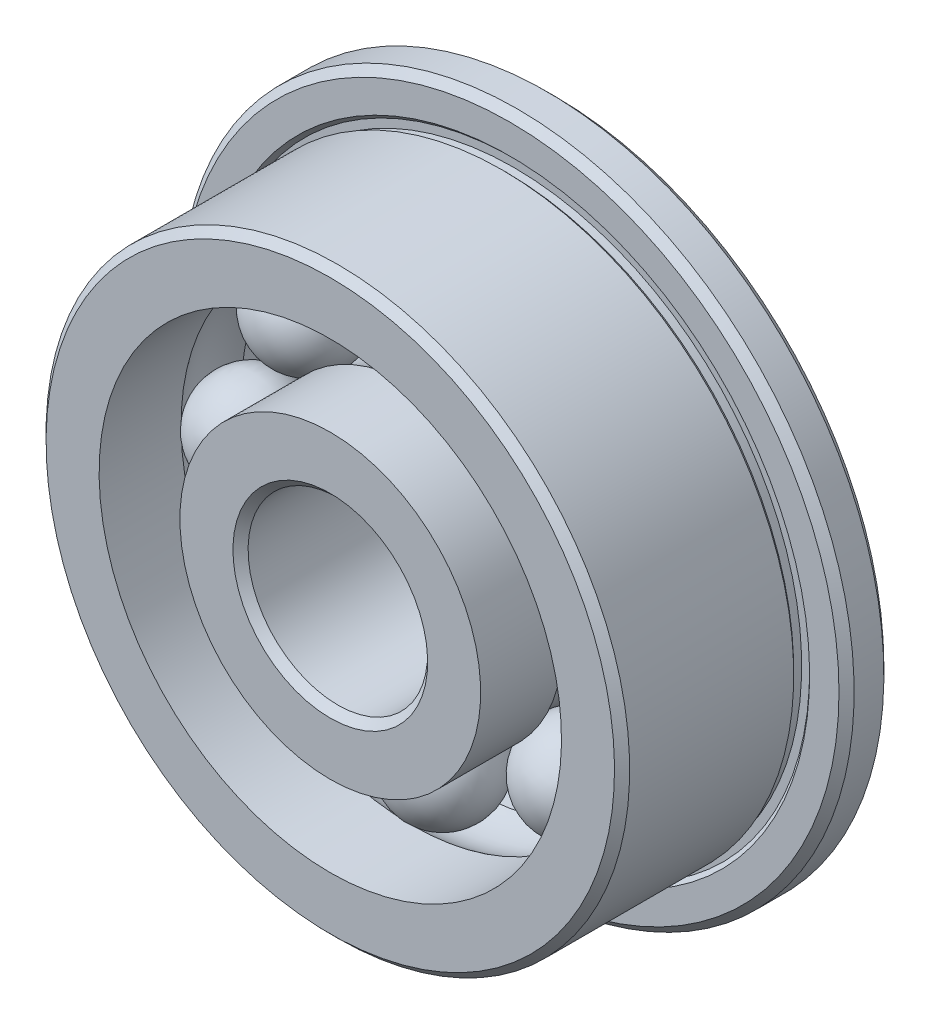
ISO-10303-21;
HEADER;
FILE_DESCRIPTION(('STEP AP214'),'2;1');
FILE_NAME('part.step','',(''),(''),'','','');
FILE_SCHEMA(('AUTOMOTIVE_DESIGN { 1 0 10303 214 1 1 1 1 }'));
ENDSEC;
DATA;
#1=APPLICATION_CONTEXT('core data for automotive mechanical design processes');
#2=APPLICATION_PROTOCOL_DEFINITION('international standard','automotive_design',2000,#1);
#3=PRODUCT_CONTEXT('',#1,'mechanical');
#4=PRODUCT('Part','Part','',(#3));
#5=PRODUCT_RELATED_PRODUCT_CATEGORY('part','',(#4));
#6=PRODUCT_DEFINITION_FORMATION('','',#4);
#7=PRODUCT_DEFINITION_CONTEXT('part definition',#1,'design');
#8=PRODUCT_DEFINITION('design','',#6,#7);
#9=PRODUCT_DEFINITION_SHAPE('','',#8);
#10=(LENGTH_UNIT() NAMED_UNIT(*) SI_UNIT(.MILLI.,.METRE.));
#11=(NAMED_UNIT(*) PLANE_ANGLE_UNIT() SI_UNIT($,.RADIAN.));
#12=(NAMED_UNIT(*) SI_UNIT($,.STERADIAN.) SOLID_ANGLE_UNIT());
#13=UNCERTAINTY_MEASURE_WITH_UNIT(LENGTH_MEASURE(1.E-05),#10,'distance_accuracy_value','');
#14=(GEOMETRIC_REPRESENTATION_CONTEXT(3) GLOBAL_UNCERTAINTY_ASSIGNED_CONTEXT((#13)) GLOBAL_UNIT_ASSIGNED_CONTEXT((#10,
#11,#12)) REPRESENTATION_CONTEXT('',''));
#15=CARTESIAN_POINT('',(0.,0.,0.));
#16=DIRECTION('',(0.,0.,1.));
#17=DIRECTION('',(1.,0.,0.));
#18=AXIS2_PLACEMENT_3D('',#15,#16,#17);
#19=CARTESIAN_POINT('',(-3.00520382004279,3.00520382004286,0.));
#20=DIRECTION('',(-0.707106781186539,0.707106781186556,0.));
#21=DIRECTION('',(0.707106781186556,0.707106781186539,0.));
#22=AXIS2_PLACEMENT_3D('',#19,#20,#21);
#23=SPHERICAL_SURFACE('',#22,1.125);
#24=CARTESIAN_POINT('',(-3.80069894887765,3.80069894887774,0.));
#25=VERTEX_POINT('',#24);
#26=VERTEX_LOOP('',#25);
#27=FACE_BOUND('',#26,.T.);
#28=ADVANCED_FACE('F46',(#27),#23,.T.);
#29=CLOSED_SHELL('',(#28));
#30=MANIFOLD_SOLID_BREP('B2',#29);
#31=CARTESIAN_POINT('',(-4.25,0.,0.));
#32=DIRECTION('',(-1.,0.,0.));
#33=DIRECTION('',(0.,1.,0.));
#34=AXIS2_PLACEMENT_3D('',#31,#32,#33);
#35=SPHERICAL_SURFACE('',#34,1.125);
#36=CARTESIAN_POINT('',(-5.375,0.,0.));
#37=VERTEX_POINT('',#36);
#38=VERTEX_LOOP('',#37);
#39=FACE_BOUND('',#38,.T.);
#40=ADVANCED_FACE('F65',(#39),#35,.T.);
#41=CLOSED_SHELL('',(#40));
#42=MANIFOLD_SOLID_BREP('B7',#41);
#43=CARTESIAN_POINT('',(-3.00520382004285,-3.0052038200428,0.));
#44=DIRECTION('',(-0.707106781186554,-0.707106781186541,0.));
#45=DIRECTION('',(-0.707106781186541,0.707106781186554,0.));
#46=AXIS2_PLACEMENT_3D('',#43,#44,#45);
#47=SPHERICAL_SURFACE('',#46,1.125);
#48=CARTESIAN_POINT('',(-3.80069894887773,-3.80069894887766,0.));
#49=VERTEX_POINT('',#48);
#50=VERTEX_LOOP('',#49);
#51=FACE_BOUND('',#50,.T.);
#52=ADVANCED_FACE('F84',(#51),#47,.T.);
#53=CLOSED_SHELL('',(#52));
#54=MANIFOLD_SOLID_BREP('B42',#53);
#55=CARTESIAN_POINT('',(0.,-4.25,0.));
#56=DIRECTION('',(0.,-1.,0.));
#57=DIRECTION('',(-1.,0.,0.));
#58=AXIS2_PLACEMENT_3D('',#55,#56,#57);
#59=SPHERICAL_SURFACE('',#58,1.125);
#60=CARTESIAN_POINT('',(0.,-5.375,0.));
#61=VERTEX_POINT('',#60);
#62=VERTEX_LOOP('',#61);
#63=FACE_BOUND('',#62,.T.);
#64=ADVANCED_FACE('F103',(#63),#59,.T.);
#65=CLOSED_SHELL('',(#64));
#66=MANIFOLD_SOLID_BREP('B61',#65);
#67=CARTESIAN_POINT('',(3.00520382004281,-3.00520382004284,0.));
#68=DIRECTION('',(0.707106781186544,-0.707106781186551,0.));
#69=DIRECTION('',(-0.707106781186551,-0.707106781186544,0.));
#70=AXIS2_PLACEMENT_3D('',#67,#68,#69);
#71=SPHERICAL_SURFACE('',#70,1.125);
#72=CARTESIAN_POINT('',(3.80069894887767,-3.80069894887771,0.));
#73=VERTEX_POINT('',#72);
#74=VERTEX_LOOP('',#73);
#75=FACE_BOUND('',#74,.T.);
#76=ADVANCED_FACE('F122',(#75),#71,.T.);
#77=CLOSED_SHELL('',(#76));
#78=MANIFOLD_SOLID_BREP('B80',#77);
#79=CARTESIAN_POINT('',(4.25,0.,0.));
#80=DIRECTION('',(1.,0.,0.));
#81=DIRECTION('',(0.,-1.,0.));
#82=AXIS2_PLACEMENT_3D('',#79,#80,#81);
#83=SPHERICAL_SURFACE('',#82,1.125);
#84=CARTESIAN_POINT('',(5.375,0.,0.));
#85=VERTEX_POINT('',#84);
#86=VERTEX_LOOP('',#85);
#87=FACE_BOUND('',#86,.T.);
#88=ADVANCED_FACE('F141',(#87),#83,.T.);
#89=CLOSED_SHELL('',(#88));
#90=MANIFOLD_SOLID_BREP('B99',#89);
#91=CARTESIAN_POINT('',(3.00520382004283,3.00520382004282,0.));
#92=DIRECTION('',(0.707106781186549,0.707106781186546,0.));
#93=DIRECTION('',(0.707106781186546,-0.707106781186549,0.));
#94=AXIS2_PLACEMENT_3D('',#91,#92,#93);
#95=SPHERICAL_SURFACE('',#94,1.125);
#96=CARTESIAN_POINT('',(3.8006989488777,3.80069894887769,0.));
#97=VERTEX_POINT('',#96);
#98=VERTEX_LOOP('',#97);
#99=FACE_BOUND('',#98,.T.);
#100=ADVANCED_FACE('F160',(#99),#95,.T.);
#101=CLOSED_SHELL('',(#100));
#102=MANIFOLD_SOLID_BREP('B118',#101);
#103=CARTESIAN_POINT('',(0.,4.25,0.));
#104=DIRECTION('',(0.,1.,0.));
#105=DIRECTION('',(1.,0.,0.));
#106=AXIS2_PLACEMENT_3D('',#103,#104,#105);
#107=SPHERICAL_SURFACE('',#106,1.125);
#108=CARTESIAN_POINT('',(0.,5.375,0.));
#109=VERTEX_POINT('',#108);
#110=VERTEX_LOOP('',#109);
#111=FACE_BOUND('',#110,.T.);
#112=ADVANCED_FACE('F182',(#111),#107,.T.);
#113=CLOSED_SHELL('',(#112));
#114=MANIFOLD_SOLID_BREP('B137',#113);
#115=CARTESIAN_POINT('',(0.,0.,0.));
#116=DIRECTION('',(0.,0.,1.));
#117=DIRECTION('',(0.,-1.,0.));
#118=AXIS2_PLACEMENT_3D('',#115,#116,#117);
#119=CYLINDRICAL_SURFACE('',#118,3.35);
#120=CARTESIAN_POINT('',(0.,0.,-0.675000000000002));
#121=DIRECTION('',(0.,0.,1.));
#122=DIRECTION('',(0.,-1.,0.));
#123=AXIS2_PLACEMENT_3D('',#120,#121,#122);
#124=CIRCLE('',#123,3.35);
#125=CARTESIAN_POINT('',(0.,-3.35,-0.675000000000002));
#126=VERTEX_POINT('',#125);
#127=EDGE_CURVE('E222',#126,#126,#124,.T.);
#128=ORIENTED_EDGE('',*,*,#127,.F.);
#129=EDGE_LOOP('',(#128));
#130=FACE_BOUND('',#129,.T.);
#131=CARTESIAN_POINT('',(0.,0.,-2.5));
#132=DIRECTION('',(0.,0.,1.));
#133=DIRECTION('',(0.,-1.,0.));
#134=AXIS2_PLACEMENT_3D('',#131,#132,#133);
#135=CIRCLE('',#134,3.35);
#136=CARTESIAN_POINT('',(0.,-3.35,-2.5));
#137=VERTEX_POINT('',#136);
#138=EDGE_CURVE('E231',#137,#137,#135,.T.);
#139=ORIENTED_EDGE('',*,*,#138,.T.);
#140=EDGE_LOOP('',(#139));
#141=FACE_BOUND('',#140,.T.);
#142=ADVANCED_FACE('F202',(#130,#141),#119,.T.);
#143=CARTESIAN_POINT('',(0.,0.,0.));
#144=DIRECTION('',(0.,0.,1.));
#145=DIRECTION('',(0.,-1.,0.));
#146=AXIS2_PLACEMENT_3D('',#143,#144,#145);
#147=TOROIDAL_SURFACE('',#146,4.25,1.125);
#148=CARTESIAN_POINT('',(0.,0.,0.675));
#149=DIRECTION('',(0.,0.,1.));
#150=DIRECTION('',(0.,-1.,0.));
#151=AXIS2_PLACEMENT_3D('',#148,#149,#150);
#152=CIRCLE('',#151,3.35);
#153=CARTESIAN_POINT('',(0.,-3.35,0.675));
#154=VERTEX_POINT('',#153);
#155=EDGE_CURVE('E225',#154,#154,#152,.T.);
#156=ORIENTED_EDGE('',*,*,#155,.F.);
#157=EDGE_LOOP('',(#156));
#158=FACE_BOUND('',#157,.T.);
#159=ORIENTED_EDGE('',*,*,#127,.T.);
#160=EDGE_LOOP('',(#159));
#161=FACE_BOUND('',#160,.T.);
#162=ADVANCED_FACE('F250',(#158,#161),#147,.F.);
#163=CARTESIAN_POINT('',(0.,0.,0.));
#164=DIRECTION('',(0.,0.,1.));
#165=DIRECTION('',(0.,-1.,0.));
#166=AXIS2_PLACEMENT_3D('',#163,#164,#165);
#167=CYLINDRICAL_SURFACE('',#166,3.35);
#168=CARTESIAN_POINT('',(0.,0.,2.5));
#169=DIRECTION('',(0.,0.,1.));
#170=DIRECTION('',(0.,-1.,0.));
#171=AXIS2_PLACEMENT_3D('',#168,#169,#170);
#172=CIRCLE('',#171,3.35);
#173=CARTESIAN_POINT('',(0.,-3.35,2.5));
#174=VERTEX_POINT('',#173);
#175=EDGE_CURVE('E228',#174,#174,#172,.T.);
#176=ORIENTED_EDGE('',*,*,#175,.F.);
#177=EDGE_LOOP('',(#176));
#178=FACE_BOUND('',#177,.T.);
#179=ORIENTED_EDGE('',*,*,#155,.T.);
#180=EDGE_LOOP('',(#179));
#181=FACE_BOUND('',#180,.T.);
#182=ADVANCED_FACE('F256',(#178,#181),#167,.T.);
#183=CARTESIAN_POINT('',(0.,2.,2.5));
#184=DIRECTION('',(0.,0.,-1.));
#185=DIRECTION('',(0.,1.,0.));
#186=AXIS2_PLACEMENT_3D('',#183,#184,#185);
#187=PLANE('',#186);
#188=CARTESIAN_POINT('',(0.,0.,2.5));
#189=DIRECTION('',(0.,0.,-1.));
#190=DIRECTION('',(0.,1.,0.));
#191=AXIS2_PLACEMENT_3D('',#188,#189,#190);
#192=CIRCLE('',#191,2.16875);
#193=CARTESIAN_POINT('',(0.,-2.16875,2.5));
#194=VERTEX_POINT('',#193);
#195=EDGE_CURVE('E181',#194,#194,#192,.T.);
#196=ORIENTED_EDGE('',*,*,#195,.T.);
#197=EDGE_LOOP('',(#196));
#198=FACE_BOUND('',#197,.T.);
#199=ORIENTED_EDGE('',*,*,#175,.T.);
#200=EDGE_LOOP('',(#199));
#201=FACE_BOUND('',#200,.T.);
#202=ADVANCED_FACE('F247',(#198,#201),#187,.F.);
#203=CARTESIAN_POINT('',(0.,0.,0.));
#204=DIRECTION('',(0.,0.,1.));
#205=DIRECTION('',(0.,-1.,0.));
#206=AXIS2_PLACEMENT_3D('',#203,#204,#205);
#207=CYLINDRICAL_SURFACE('',#206,2.);
#208=CARTESIAN_POINT('',(0.,0.,-2.33125));
#209=DIRECTION('',(0.,0.,1.));
#210=DIRECTION('',(0.,-1.,0.));
#211=AXIS2_PLACEMENT_3D('',#208,#209,#210);
#212=CIRCLE('',#211,2.);
#213=CARTESIAN_POINT('',(0.,-2.,-2.33125));
#214=VERTEX_POINT('',#213);
#215=EDGE_CURVE('E209',#214,#214,#212,.F.);
#216=CARTESIAN_POINT('',(0.,0.,2.33125));
#217=DIRECTION('',(0.,0.,-1.));
#218=DIRECTION('',(0.,1.,0.));
#219=AXIS2_PLACEMENT_3D('',#216,#217,#218);
#220=CIRCLE('',#219,2.);
#221=CARTESIAN_POINT('',(0.,-2.,2.33125));
#222=VERTEX_POINT('',#221);
#223=EDGE_CURVE('E213',#222,#222,#220,.F.);
#224=CARTESIAN_POINT('',(0.,-2.,-2.33125));
#225=CARTESIAN_POINT('',(0.,-2.,-2.28268229166667));
#226=CARTESIAN_POINT('',(0.,-2.,-2.23411458333333));
#227=CARTESIAN_POINT('',(0.,-2.,-2.13697916666667));
#228=CARTESIAN_POINT('',(0.,-2.,-2.08841145833334));
#229=CARTESIAN_POINT('',(0.,-2.,-1.99127604166667));
#230=CARTESIAN_POINT('',(0.,-2.,-1.94270833333334));
#231=CARTESIAN_POINT('',(0.,-2.,-1.84557291666667));
#232=CARTESIAN_POINT('',(0.,-2.,-1.79700520833334));
#233=CARTESIAN_POINT('',(0.,-2.,-1.69986979166667));
#234=CARTESIAN_POINT('',(0.,-2.,-1.65130208333334));
#235=CARTESIAN_POINT('',(0.,-2.,-1.55416666666667));
#236=CARTESIAN_POINT('',(0.,-2.,-1.50559895833333));
#237=CARTESIAN_POINT('',(0.,-2.,-1.40846354166667));
#238=CARTESIAN_POINT('',(0.,-2.,-1.35989583333333));
#239=CARTESIAN_POINT('',(0.,-2.,-1.26276041666667));
#240=CARTESIAN_POINT('',(0.,-2.,-1.21419270833333));
#241=CARTESIAN_POINT('',(0.,-2.,-1.11705729166667));
#242=CARTESIAN_POINT('',(0.,-2.,-1.06848958333333));
#243=CARTESIAN_POINT('',(0.,-2.,-0.971354166666668));
#244=CARTESIAN_POINT('',(0.,-2.,-0.922786458333335));
#245=CARTESIAN_POINT('',(0.,-2.,-0.825651041666668));
#246=CARTESIAN_POINT('',(0.,-2.,-0.777083333333335));
#247=CARTESIAN_POINT('',(0.,-2.,-0.679947916666668));
#248=CARTESIAN_POINT('',(0.,-2.,-0.631380208333335));
#249=CARTESIAN_POINT('',(0.,-2.,-0.534244791666668));
#250=CARTESIAN_POINT('',(0.,-2.,-0.485677083333335));
#251=CARTESIAN_POINT('',(0.,-2.,-0.388541666666668));
#252=CARTESIAN_POINT('',(0.,-2.,-0.339973958333334));
#253=CARTESIAN_POINT('',(0.,-2.,-0.242838541666668));
#254=CARTESIAN_POINT('',(0.,-2.,-0.194270833333334));
#255=CARTESIAN_POINT('',(0.,-2.,-0.0971354166666678));
#256=CARTESIAN_POINT('',(0.,-2.,-0.0485677083333344));
#257=CARTESIAN_POINT('',(0.,-2.,0.0485677083333323));
#258=CARTESIAN_POINT('',(0.,-2.,0.0971354166666656));
#259=CARTESIAN_POINT('',(0.,-2.,0.194270833333332));
#260=CARTESIAN_POINT('',(0.,-2.,0.242838541666666));
#261=CARTESIAN_POINT('',(0.,-2.,0.339973958333332));
#262=CARTESIAN_POINT('',(0.,-2.,0.388541666666666));
#263=CARTESIAN_POINT('',(0.,-2.,0.485677083333332));
#264=CARTESIAN_POINT('',(0.,-2.,0.534244791666666));
#265=CARTESIAN_POINT('',(0.,-2.,0.631380208333332));
#266=CARTESIAN_POINT('',(0.,-2.,0.679947916666666));
#267=CARTESIAN_POINT('',(0.,-2.,0.777083333333333));
#268=CARTESIAN_POINT('',(0.,-2.,0.825651041666666));
#269=CARTESIAN_POINT('',(0.,-2.,0.922786458333333));
#270=CARTESIAN_POINT('',(0.,-2.,0.971354166666666));
#271=CARTESIAN_POINT('',(0.,-2.,1.06848958333333));
#272=CARTESIAN_POINT('',(0.,-2.,1.11705729166667));
#273=CARTESIAN_POINT('',(0.,-2.,1.21419270833333));
#274=CARTESIAN_POINT('',(0.,-2.,1.26276041666667));
#275=CARTESIAN_POINT('',(0.,-2.,1.35989583333333));
#276=CARTESIAN_POINT('',(0.,-2.,1.40846354166667));
#277=CARTESIAN_POINT('',(0.,-2.,1.50559895833333));
#278=CARTESIAN_POINT('',(0.,-2.,1.55416666666667));
#279=CARTESIAN_POINT('',(0.,-2.,1.65130208333333));
#280=CARTESIAN_POINT('',(0.,-2.,1.69986979166667));
#281=CARTESIAN_POINT('',(0.,-2.,1.79700520833333));
#282=CARTESIAN_POINT('',(0.,-2.,1.84557291666667));
#283=CARTESIAN_POINT('',(0.,-2.,1.94270833333333));
#284=CARTESIAN_POINT('',(0.,-2.,1.99127604166667));
#285=CARTESIAN_POINT('',(0.,-2.,2.08841145833333));
#286=CARTESIAN_POINT('',(0.,-2.,2.13697916666667));
#287=CARTESIAN_POINT('',(0.,-2.,2.23411458333333));
#288=CARTESIAN_POINT('',(0.,-2.,2.28268229166667));
#289=CARTESIAN_POINT('',(0.,-2.,2.33125));
#290=B_SPLINE_CURVE_WITH_KNOTS('',3,(#224,#225,#226,#227,#228,#229,#230,#231,#232,#233,#234,
#235,#236,#237,#238,#239,#240,#241,#242,#243,#244,#245,#246,#247,#248,#249,#250,#251,#252,#253,
#254,#255,#256,#257,#258,#259,#260,#261,#262,#263,#264,#265,#266,#267,#268,#269,#270,#271,#272,
#273,#274,#275,#276,#277,#278,#279,#280,#281,#282,#283,#284,#285,#286,#287,#288,#289),
.UNSPECIFIED.,.F.,.F.,(4,2,2,2,2,2,2,2,2,2,2,2,2,2,2,2,2,2,2,2,2,2,2,2,2,2,2,2,2,2,2,2,4),(0.,
0.145703125,0.29140625,0.437109375,0.5828125,0.728515625,0.87421875,1.019921875,1.165625,
1.311328125,1.45703125,1.602734375,1.7484375,1.894140625,2.03984375,2.185546875,2.33125,
2.476953125,2.62265625,2.768359375,2.9140625,3.059765625,3.20546875,3.351171875,3.496875,
3.642578125,3.78828125,3.933984375,4.0796875,4.225390625,4.37109375,4.516796875,4.6625),.UNSPECIFIED.);
#291=EDGE_CURVE('BSEAM239',#214,#222,#290,.T.);
#292=ORIENTED_EDGE('',*,*,#215,.T.);
#293=ORIENTED_EDGE('',*,*,#223,.T.);
#294=ORIENTED_EDGE('',*,*,#291,.T.);
#295=ORIENTED_EDGE('',*,*,#291,.F.);
#296=EDGE_LOOP('',(#292,#294,#293,#295));
#297=FACE_BOUND('',#296,.T.);
#298=ADVANCED_FACE('F239',(#297),#207,.F.);
#299=CARTESIAN_POINT('',(0.,3.35,-2.5));
#300=DIRECTION('',(0.,0.,1.));
#301=DIRECTION('',(0.,-1.,0.));
#302=AXIS2_PLACEMENT_3D('',#299,#300,#301);
#303=PLANE('',#302);
#304=CARTESIAN_POINT('',(0.,0.,-2.5));
#305=DIRECTION('',(0.,0.,1.));
#306=DIRECTION('',(0.,-1.,0.));
#307=AXIS2_PLACEMENT_3D('',#304,#305,#306);
#308=CIRCLE('',#307,2.16875);
#309=CARTESIAN_POINT('',(0.,-2.16875,-2.5));
#310=VERTEX_POINT('',#309);
#311=EDGE_CURVE('E217',#310,#310,#308,.T.);
#312=ORIENTED_EDGE('',*,*,#311,.T.);
#313=EDGE_LOOP('',(#312));
#314=FACE_BOUND('',#313,.T.);
#315=ORIENTED_EDGE('',*,*,#138,.F.);
#316=EDGE_LOOP('',(#315));
#317=FACE_BOUND('',#316,.T.);
#318=ADVANCED_FACE('F236',(#314,#317),#303,.F.);
#319=CARTESIAN_POINT('',(0.,0.,-2.5));
#320=DIRECTION('',(0.,0.,-1.));
#321=DIRECTION('',(0.,1.,0.));
#322=AXIS2_PLACEMENT_3D('',#319,#320,#321);
#323=CONICAL_SURFACE('',#322,2.16875,0.785398163397448);
#324=ORIENTED_EDGE('',*,*,#215,.F.);
#325=EDGE_LOOP('',(#324));
#326=FACE_BOUND('',#325,.T.);
#327=ORIENTED_EDGE('',*,*,#311,.F.);
#328=EDGE_LOOP('',(#327));
#329=FACE_BOUND('',#328,.T.);
#330=ADVANCED_FACE('F238',(#326,#329),#323,.F.);
#331=CARTESIAN_POINT('',(0.,0.,2.33125));
#332=DIRECTION('',(0.,0.,1.));
#333=DIRECTION('',(0.,-1.,0.));
#334=AXIS2_PLACEMENT_3D('',#331,#332,#333);
#335=CONICAL_SURFACE('',#334,2.,0.785398163397448);
#336=CARTESIAN_POINT('',(0.,-2.16875,2.5));
#337=CARTESIAN_POINT('',(0.,-2.1669921875,2.4982421875));
#338=CARTESIAN_POINT('',(0.,-2.165234375,2.496484375));
#339=CARTESIAN_POINT('',(0.,-2.16171875,2.49296875));
#340=CARTESIAN_POINT('',(0.,-2.1599609375,2.4912109375));
#341=CARTESIAN_POINT('',(0.,-2.1564453125,2.4876953125));
#342=CARTESIAN_POINT('',(0.,-2.1546875,2.4859375));
#343=CARTESIAN_POINT('',(0.,-2.151171875,2.482421875));
#344=CARTESIAN_POINT('',(0.,-2.1494140625,2.4806640625));
#345=CARTESIAN_POINT('',(0.,-2.1458984375,2.4771484375));
#346=CARTESIAN_POINT('',(0.,-2.144140625,2.475390625));
#347=CARTESIAN_POINT('',(0.,-2.140625,2.471875));
#348=CARTESIAN_POINT('',(0.,-2.1388671875,2.4701171875));
#349=CARTESIAN_POINT('',(0.,-2.1353515625,2.4666015625));
#350=CARTESIAN_POINT('',(0.,-2.13359375,2.46484375));
#351=CARTESIAN_POINT('',(0.,-2.130078125,2.461328125));
#352=CARTESIAN_POINT('',(0.,-2.1283203125,2.4595703125));
#353=CARTESIAN_POINT('',(0.,-2.1248046875,2.4560546875));
#354=CARTESIAN_POINT('',(0.,-2.123046875,2.454296875));
#355=CARTESIAN_POINT('',(0.,-2.11953125,2.45078125));
#356=CARTESIAN_POINT('',(0.,-2.1177734375,2.4490234375));
#357=CARTESIAN_POINT('',(0.,-2.1142578125,2.4455078125));
#358=CARTESIAN_POINT('',(0.,-2.1125,2.44375));
#359=CARTESIAN_POINT('',(0.,-2.108984375,2.440234375));
#360=CARTESIAN_POINT('',(0.,-2.1072265625,2.4384765625));
#361=CARTESIAN_POINT('',(0.,-2.1037109375,2.4349609375));
#362=CARTESIAN_POINT('',(0.,-2.101953125,2.433203125));
#363=CARTESIAN_POINT('',(0.,-2.0984375,2.4296875));
#364=CARTESIAN_POINT('',(0.,-2.0966796875,2.4279296875));
#365=CARTESIAN_POINT('',(0.,-2.0931640625,2.4244140625));
#366=CARTESIAN_POINT('',(0.,-2.09140625,2.42265625));
#367=CARTESIAN_POINT('',(0.,-2.087890625,2.419140625));
#368=CARTESIAN_POINT('',(0.,-2.0861328125,2.4173828125));
#369=CARTESIAN_POINT('',(0.,-2.0826171875,2.4138671875));
#370=CARTESIAN_POINT('',(0.,-2.080859375,2.412109375));
#371=CARTESIAN_POINT('',(0.,-2.07734375,2.40859375));
#372=CARTESIAN_POINT('',(0.,-2.0755859375,2.4068359375));
#373=CARTESIAN_POINT('',(0.,-2.0720703125,2.4033203125));
#374=CARTESIAN_POINT('',(0.,-2.0703125,2.4015625));
#375=CARTESIAN_POINT('',(0.,-2.066796875,2.398046875));
#376=CARTESIAN_POINT('',(0.,-2.0650390625,2.3962890625));
#377=CARTESIAN_POINT('',(0.,-2.0615234375,2.3927734375));
#378=CARTESIAN_POINT('',(0.,-2.059765625,2.391015625));
#379=CARTESIAN_POINT('',(0.,-2.05625,2.3875));
#380=CARTESIAN_POINT('',(0.,-2.0544921875,2.3857421875));
#381=CARTESIAN_POINT('',(0.,-2.0509765625,2.3822265625));
#382=CARTESIAN_POINT('',(0.,-2.04921875,2.38046875));
#383=CARTESIAN_POINT('',(0.,-2.045703125,2.376953125));
#384=CARTESIAN_POINT('',(0.,-2.0439453125,2.3751953125));
#385=CARTESIAN_POINT('',(0.,-2.0404296875,2.3716796875));
#386=CARTESIAN_POINT('',(0.,-2.038671875,2.369921875));
#387=CARTESIAN_POINT('',(0.,-2.03515625,2.36640625));
#388=CARTESIAN_POINT('',(0.,-2.0333984375,2.3646484375));
#389=CARTESIAN_POINT('',(0.,-2.0298828125,2.3611328125));
#390=CARTESIAN_POINT('',(0.,-2.028125,2.359375));
#391=CARTESIAN_POINT('',(0.,-2.024609375,2.355859375));
#392=CARTESIAN_POINT('',(0.,-2.0228515625,2.3541015625));
#393=CARTESIAN_POINT('',(0.,-2.0193359375,2.3505859375));
#394=CARTESIAN_POINT('',(0.,-2.017578125,2.348828125));
#395=CARTESIAN_POINT('',(0.,-2.0140625,2.3453125));
#396=CARTESIAN_POINT('',(0.,-2.0123046875,2.3435546875));
#397=CARTESIAN_POINT('',(0.,-2.0087890625,2.3400390625));
#398=CARTESIAN_POINT('',(0.,-2.00703125,2.33828125));
#399=CARTESIAN_POINT('',(0.,-2.003515625,2.334765625));
#400=CARTESIAN_POINT('',(0.,-2.0017578125,2.3330078125));
#401=CARTESIAN_POINT('',(0.,-2.,2.33125));
#402=B_SPLINE_CURVE_WITH_KNOTS('',3,(#336,#337,#338,#339,#340,#341,#342,#343,#344,#345,#346,
#347,#348,#349,#350,#351,#352,#353,#354,#355,#356,#357,#358,#359,#360,#361,#362,#363,#364,#365,
#366,#367,#368,#369,#370,#371,#372,#373,#374,#375,#376,#377,#378,#379,#380,#381,#382,#383,#384,
#385,#386,#387,#388,#389,#390,#391,#392,#393,#394,#395,#396,#397,#398,#399,#400,#401),
.UNSPECIFIED.,.F.,.F.,(4,2,2,2,2,2,2,2,2,2,2,2,2,2,2,2,2,2,2,2,2,2,2,2,2,2,2,2,2,2,2,2,4),(0.,
0.00745776683282727,0.0149155336656539,0.0223733004984806,0.0298310673313079,0.0372888341641345,
0.0447466009969615,0.0522043678297885,0.0596621346626151,0.0671199014954424,0.0745776683282691,
0.0820354351610957,0.089493201993923,0.0969509688267496,0.104408735659576,0.111866502492404,
0.11932426932523,0.126782036158057,0.134239802990884,0.141697569823711,0.149155336656537,
0.156613103489365,0.164070870322191,0.171528637155018,0.178986403987845,0.186444170820672,
0.193901937653499,0.201359704486326,0.208817471319153,0.216275238151979,0.223733004984807,
0.231190771817633,0.23864853865046),.UNSPECIFIED.);
#403=EDGE_CURVE('BSEAM204',#194,#222,#402,.T.);
#404=ORIENTED_EDGE('',*,*,#195,.F.);
#405=ORIENTED_EDGE('',*,*,#223,.F.);
#406=ORIENTED_EDGE('',*,*,#403,.T.);
#407=ORIENTED_EDGE('',*,*,#403,.F.);
#408=EDGE_LOOP('',(#404,#406,#405,#407));
#409=FACE_BOUND('',#408,.T.);
#410=ADVANCED_FACE('F204',(#409),#335,.F.);
#411=CLOSED_SHELL('',(#142,#162,#182,#202,#298,#318,#330,#410));
#412=MANIFOLD_SOLID_BREP('B156',#411);
#413=CARTESIAN_POINT('',(0.,5.15,-2.5));
#414=DIRECTION('',(0.,0.,1.));
#415=DIRECTION('',(0.,-1.,0.));
#416=AXIS2_PLACEMENT_3D('',#413,#414,#415);
#417=PLANE('',#416);
#418=CARTESIAN_POINT('',(0.,0.,-2.5));
#419=DIRECTION('',(0.,0.,1.));
#420=DIRECTION('',(0.,-1.,0.));
#421=AXIS2_PLACEMENT_3D('',#418,#419,#420);
#422=CIRCLE('',#421,7.33125);
#423=CARTESIAN_POINT('',(0.,-7.33125,-2.5));
#424=VERTEX_POINT('',#423);
#425=EDGE_CURVE('E324',#424,#424,#422,.F.);
#426=ORIENTED_EDGE('',*,*,#425,.T.);
#427=EDGE_LOOP('',(#426));
#428=FACE_BOUND('',#427,.T.);
#429=CARTESIAN_POINT('',(0.,0.,-2.5));
#430=DIRECTION('',(0.,0.,1.));
#431=DIRECTION('',(0.,-1.,0.));
#432=AXIS2_PLACEMENT_3D('',#429,#430,#431);
#433=CIRCLE('',#432,5.15);
#434=CARTESIAN_POINT('',(0.,-5.15,-2.5));
#435=VERTEX_POINT('',#434);
#436=EDGE_CURVE('E335',#435,#435,#433,.T.);
#437=ORIENTED_EDGE('',*,*,#436,.T.);
#438=EDGE_LOOP('',(#437));
#439=FACE_BOUND('',#438,.T.);
#440=ADVANCED_FACE('F309',(#428,#439),#417,.F.);
#441=CARTESIAN_POINT('',(0.,0.,0.));
#442=DIRECTION('',(0.,0.,1.));
#443=DIRECTION('',(0.,-1.,0.));
#444=AXIS2_PLACEMENT_3D('',#441,#442,#443);
#445=CYLINDRICAL_SURFACE('',#444,5.15);
#446=ORIENTED_EDGE('',*,*,#436,.F.);
#447=EDGE_LOOP('',(#446));
#448=FACE_BOUND('',#447,.T.);
#449=CARTESIAN_POINT('',(0.,0.,-0.675000000000002));
#450=DIRECTION('',(0.,0.,1.));
#451=DIRECTION('',(0.,-1.,0.));
#452=AXIS2_PLACEMENT_3D('',#449,#450,#451);
#453=CIRCLE('',#452,5.15);
#454=CARTESIAN_POINT('',(0.,-5.15,-0.675000000000002));
#455=VERTEX_POINT('',#454);
#456=EDGE_CURVE('E338',#455,#455,#453,.T.);
#457=ORIENTED_EDGE('',*,*,#456,.T.);
#458=EDGE_LOOP('',(#457));
#459=FACE_BOUND('',#458,.T.);
#460=ADVANCED_FACE('F382',(#448,#459),#445,.F.);
#461=CARTESIAN_POINT('',(0.,0.,0.));
#462=DIRECTION('',(0.,0.,1.));
#463=DIRECTION('',(0.,-1.,0.));
#464=AXIS2_PLACEMENT_3D('',#461,#462,#463);
#465=TOROIDAL_SURFACE('',#464,4.25,1.125);
#466=ORIENTED_EDGE('',*,*,#456,.F.);
#467=EDGE_LOOP('',(#466));
#468=FACE_BOUND('',#467,.T.);
#469=CARTESIAN_POINT('',(0.,0.,0.675));
#470=DIRECTION('',(0.,0.,1.));
#471=DIRECTION('',(0.,-1.,0.));
#472=AXIS2_PLACEMENT_3D('',#469,#470,#471);
#473=CIRCLE('',#472,5.15);
#474=CARTESIAN_POINT('',(0.,-5.15,0.675));
#475=VERTEX_POINT('',#474);
#476=EDGE_CURVE('E341',#475,#475,#473,.T.);
#477=ORIENTED_EDGE('',*,*,#476,.T.);
#478=EDGE_LOOP('',(#477));
#479=FACE_BOUND('',#478,.T.);
#480=ADVANCED_FACE('F389',(#468,#479),#465,.F.);
#481=CARTESIAN_POINT('',(0.,0.,0.));
#482=DIRECTION('',(0.,0.,1.));
#483=DIRECTION('',(0.,-1.,0.));
#484=AXIS2_PLACEMENT_3D('',#481,#482,#483);
#485=CYLINDRICAL_SURFACE('',#484,5.15);
#486=ORIENTED_EDGE('',*,*,#476,.F.);
#487=EDGE_LOOP('',(#486));
#488=FACE_BOUND('',#487,.T.);
#489=CARTESIAN_POINT('',(0.,0.,2.5));
#490=DIRECTION('',(0.,0.,1.));
#491=DIRECTION('',(0.,-1.,0.));
#492=AXIS2_PLACEMENT_3D('',#489,#490,#491);
#493=CIRCLE('',#492,5.15);
#494=CARTESIAN_POINT('',(0.,-5.15,2.5));
#495=VERTEX_POINT('',#494);
#496=EDGE_CURVE('E344',#495,#495,#493,.T.);
#497=ORIENTED_EDGE('',*,*,#496,.T.);
#498=EDGE_LOOP('',(#497));
#499=FACE_BOUND('',#498,.T.);
#500=ADVANCED_FACE('F464',(#488,#499),#485,.F.);
#501=CARTESIAN_POINT('',(0.,6.5,2.5));
#502=DIRECTION('',(0.,0.,-1.));
#503=DIRECTION('',(0.,1.,0.));
#504=AXIS2_PLACEMENT_3D('',#501,#502,#503);
#505=PLANE('',#504);
#506=CARTESIAN_POINT('',(0.,0.,2.5));
#507=DIRECTION('',(0.,0.,-1.));
#508=DIRECTION('',(0.,1.,0.));
#509=AXIS2_PLACEMENT_3D('',#506,#507,#508);
#510=CIRCLE('',#509,6.33125);
#511=CARTESIAN_POINT('',(0.,6.33125,2.5));
#512=VERTEX_POINT('',#511);
#513=EDGE_CURVE('E316',#512,#512,#510,.F.);
#514=ORIENTED_EDGE('',*,*,#513,.T.);
#515=EDGE_LOOP('',(#514));
#516=FACE_BOUND('',#515,.T.);
#517=ORIENTED_EDGE('',*,*,#496,.F.);
#518=EDGE_LOOP('',(#517));
#519=FACE_BOUND('',#518,.T.);
#520=ADVANCED_FACE('F458',(#516,#519),#505,.F.);
#521=CARTESIAN_POINT('',(0.,0.,0.));
#522=DIRECTION('',(0.,0.,1.));
#523=DIRECTION('',(0.,-1.,0.));
#524=AXIS2_PLACEMENT_3D('',#521,#522,#523);
#525=CYLINDRICAL_SURFACE('',#524,6.5);
#526=CARTESIAN_POINT('',(0.,0.,2.33125));
#527=DIRECTION('',(0.,0.,-1.));
#528=DIRECTION('',(0.,1.,0.));
#529=AXIS2_PLACEMENT_3D('',#526,#527,#528);
#530=CIRCLE('',#529,6.5);
#531=CARTESIAN_POINT('',(0.,6.5,2.33125));
#532=VERTEX_POINT('',#531);
#533=EDGE_CURVE('E201',#532,#532,#530,.T.);
#534=ORIENTED_EDGE('',*,*,#533,.T.);
#535=EDGE_LOOP('',(#534));
#536=FACE_BOUND('',#535,.T.);
#537=CARTESIAN_POINT('',(0.,0.,-1.32322330470336));
#538=DIRECTION('',(0.,0.,1.));
#539=DIRECTION('',(0.,-1.,0.));
#540=AXIS2_PLACEMENT_3D('',#537,#538,#539);
#541=CIRCLE('',#540,6.5);
#542=CARTESIAN_POINT('',(0.,-6.5,-1.32322330470336));
#543=VERTEX_POINT('',#542);
#544=EDGE_CURVE('E347',#543,#543,#541,.T.);
#545=ORIENTED_EDGE('',*,*,#544,.T.);
#546=EDGE_LOOP('',(#545));
#547=FACE_BOUND('',#546,.T.);
#548=ADVANCED_FACE('F450',(#536,#547),#525,.T.);
#549=CARTESIAN_POINT('',(0.,0.,-1.41161165235168));
#550=DIRECTION('',(0.,0.,1.));
#551=DIRECTION('',(0.,-1.,0.));
#552=AXIS2_PLACEMENT_3D('',#549,#550,#551);
#553=CONICAL_SURFACE('',#552,6.41161165235168,0.785398163397443);
#554=ORIENTED_EDGE('',*,*,#544,.F.);
#555=EDGE_LOOP('',(#554));
#556=FACE_BOUND('',#555,.T.);
#557=CARTESIAN_POINT('',(0.,0.,-1.41161165235168));
#558=DIRECTION('',(0.,0.,1.));
#559=DIRECTION('',(0.,-1.,0.));
#560=AXIS2_PLACEMENT_3D('',#557,#558,#559);
#561=CIRCLE('',#560,6.41161165235168);
#562=CARTESIAN_POINT('',(0.,-6.41161165235168,-1.41161165235168));
#563=VERTEX_POINT('',#562);
#564=EDGE_CURVE('E350',#563,#563,#561,.T.);
#565=ORIENTED_EDGE('',*,*,#564,.T.);
#566=EDGE_LOOP('',(#565));
#567=FACE_BOUND('',#566,.T.);
#568=ADVANCED_FACE('F442',(#556,#567),#553,.T.);
#569=CARTESIAN_POINT('',(0.,0.,0.));
#570=DIRECTION('',(0.,0.,1.));
#571=DIRECTION('',(0.,-1.,0.));
#572=AXIS2_PLACEMENT_3D('',#569,#570,#571);
#573=CYLINDRICAL_SURFACE('',#572,6.41161165235168);
#574=ORIENTED_EDGE('',*,*,#564,.F.);
#575=EDGE_LOOP('',(#574));
#576=FACE_BOUND('',#575,.T.);
#577=CARTESIAN_POINT('',(0.,0.,-1.58838834764832));
#578=DIRECTION('',(0.,0.,1.));
#579=DIRECTION('',(0.,-1.,0.));
#580=AXIS2_PLACEMENT_3D('',#577,#578,#579);
#581=CIRCLE('',#580,6.41161165235168);
#582=CARTESIAN_POINT('',(0.,-6.41161165235168,-1.58838834764832));
#583=VERTEX_POINT('',#582);
#584=EDGE_CURVE('E353',#583,#583,#581,.T.);
#585=ORIENTED_EDGE('',*,*,#584,.T.);
#586=EDGE_LOOP('',(#585));
#587=FACE_BOUND('',#586,.T.);
#588=ADVANCED_FACE('F434',(#576,#587),#573,.T.);
#589=CARTESIAN_POINT('',(0.,6.58838834764832,-1.58838834764832));
#590=DIRECTION('',(0.,0.,-1.));
#591=DIRECTION('',(0.,1.,0.));
#592=AXIS2_PLACEMENT_3D('',#589,#590,#591);
#593=PLANE('',#592);
#594=ORIENTED_EDGE('',*,*,#584,.F.);
#595=EDGE_LOOP('',(#594));
#596=FACE_BOUND('',#595,.T.);
#597=CARTESIAN_POINT('',(0.,0.,-1.58838834764832));
#598=DIRECTION('',(0.,0.,1.));
#599=DIRECTION('',(0.,-1.,0.));
#600=AXIS2_PLACEMENT_3D('',#597,#598,#599);
#601=CIRCLE('',#600,6.58838834764832);
#602=CARTESIAN_POINT('',(0.,-6.58838834764832,-1.58838834764832));
#603=VERTEX_POINT('',#602);
#604=EDGE_CURVE('E356',#603,#603,#601,.T.);
#605=ORIENTED_EDGE('',*,*,#604,.T.);
#606=EDGE_LOOP('',(#605));
#607=FACE_BOUND('',#606,.T.);
#608=ADVANCED_FACE('F378',(#596,#607),#593,.F.);
#609=CARTESIAN_POINT('',(0.,0.,-1.5));
#610=DIRECTION('',(0.,0.,1.));
#611=DIRECTION('',(0.,-1.,0.));
#612=AXIS2_PLACEMENT_3D('',#609,#610,#611);
#613=CONICAL_SURFACE('',#612,6.67677669529663,0.78539816339744);
#614=ORIENTED_EDGE('',*,*,#604,.F.);
#615=EDGE_LOOP('',(#614));
#616=FACE_BOUND('',#615,.T.);
#617=CARTESIAN_POINT('',(0.,0.,-1.5));
#618=DIRECTION('',(0.,0.,1.));
#619=DIRECTION('',(0.,-1.,0.));
#620=AXIS2_PLACEMENT_3D('',#617,#618,#619);
#621=CIRCLE('',#620,6.67677669529663);
#622=CARTESIAN_POINT('',(0.,-6.67677669529663,-1.5));
#623=VERTEX_POINT('',#622);
#624=EDGE_CURVE('E359',#623,#623,#621,.T.);
#625=ORIENTED_EDGE('',*,*,#624,.T.);
#626=EDGE_LOOP('',(#625));
#627=FACE_BOUND('',#626,.T.);
#628=ADVANCED_FACE('F363',(#616,#627),#613,.F.);
#629=CARTESIAN_POINT('',(0.,7.5,-1.5));
#630=DIRECTION('',(0.,0.,-1.));
#631=DIRECTION('',(0.,1.,0.));
#632=AXIS2_PLACEMENT_3D('',#629,#630,#631);
#633=PLANE('',#632);
#634=CARTESIAN_POINT('',(0.,0.,-1.5));
#635=DIRECTION('',(0.,0.,-1.));
#636=DIRECTION('',(0.,1.,0.));
#637=AXIS2_PLACEMENT_3D('',#634,#635,#636);
#638=CIRCLE('',#637,7.33125);
#639=CARTESIAN_POINT('',(0.,7.33125,-1.5));
#640=VERTEX_POINT('',#639);
#641=EDGE_CURVE('E320',#640,#640,#638,.F.);
#642=ORIENTED_EDGE('',*,*,#641,.T.);
#643=EDGE_LOOP('',(#642));
#644=FACE_BOUND('',#643,.T.);
#645=ORIENTED_EDGE('',*,*,#624,.F.);
#646=EDGE_LOOP('',(#645));
#647=FACE_BOUND('',#646,.T.);
#648=ADVANCED_FACE('F365',(#644,#647),#633,.F.);
#649=CARTESIAN_POINT('',(0.,0.,0.));
#650=DIRECTION('',(0.,0.,1.));
#651=DIRECTION('',(0.,-1.,0.));
#652=AXIS2_PLACEMENT_3D('',#649,#650,#651);
#653=CYLINDRICAL_SURFACE('',#652,7.5);
#654=CARTESIAN_POINT('',(0.,0.,-2.33125));
#655=DIRECTION('',(0.,0.,1.));
#656=DIRECTION('',(0.,-1.,0.));
#657=AXIS2_PLACEMENT_3D('',#654,#655,#656);
#658=CIRCLE('',#657,7.5);
#659=CARTESIAN_POINT('',(0.,-7.5,-2.33125));
#660=VERTEX_POINT('',#659);
#661=EDGE_CURVE('E329',#660,#660,#658,.T.);
#662=CARTESIAN_POINT('',(0.,0.,-1.66875));
#663=DIRECTION('',(0.,0.,-1.));
#664=DIRECTION('',(0.,1.,0.));
#665=AXIS2_PLACEMENT_3D('',#662,#663,#664);
#666=CIRCLE('',#665,7.5);
#667=CARTESIAN_POINT('',(0.,-7.5,-1.66875));
#668=VERTEX_POINT('',#667);
#669=EDGE_CURVE('E332',#668,#668,#666,.T.);
#670=CARTESIAN_POINT('',(0.,-7.5,-2.33125));
#671=CARTESIAN_POINT('',(0.,-7.5,-2.32434895833334));
#672=CARTESIAN_POINT('',(0.,-7.5,-2.31744791666667));
#673=CARTESIAN_POINT('',(0.,-7.5,-2.30364583333334));
#674=CARTESIAN_POINT('',(0.,-7.5,-2.29674479166667));
#675=CARTESIAN_POINT('',(0.,-7.5,-2.28294270833334));
#676=CARTESIAN_POINT('',(0.,-7.5,-2.27604166666667));
#677=CARTESIAN_POINT('',(0.,-7.5,-2.26223958333334));
#678=CARTESIAN_POINT('',(0.,-7.5,-2.25533854166667));
#679=CARTESIAN_POINT('',(0.,-7.5,-2.24153645833334));
#680=CARTESIAN_POINT('',(0.,-7.5,-2.23463541666667));
#681=CARTESIAN_POINT('',(0.,-7.5,-2.22083333333334));
#682=CARTESIAN_POINT('',(0.,-7.5,-2.21393229166667));
#683=CARTESIAN_POINT('',(0.,-7.5,-2.20013020833334));
#684=CARTESIAN_POINT('',(0.,-7.5,-2.19322916666667));
#685=CARTESIAN_POINT('',(0.,-7.5,-2.17942708333334));
#686=CARTESIAN_POINT('',(0.,-7.5,-2.17252604166667));
#687=CARTESIAN_POINT('',(0.,-7.5,-2.15872395833334));
#688=CARTESIAN_POINT('',(0.,-7.5,-2.15182291666667));
#689=CARTESIAN_POINT('',(0.,-7.5,-2.13802083333334));
#690=CARTESIAN_POINT('',(0.,-7.5,-2.13111979166667));
#691=CARTESIAN_POINT('',(0.,-7.5,-2.11731770833334));
#692=CARTESIAN_POINT('',(0.,-7.5,-2.11041666666667));
#693=CARTESIAN_POINT('',(0.,-7.5,-2.09661458333334));
#694=CARTESIAN_POINT('',(0.,-7.5,-2.08971354166667));
#695=CARTESIAN_POINT('',(0.,-7.5,-2.07591145833334));
#696=CARTESIAN_POINT('',(0.,-7.5,-2.06901041666667));
#697=CARTESIAN_POINT('',(0.,-7.5,-2.05520833333334));
#698=CARTESIAN_POINT('',(0.,-7.5,-2.04830729166667));
#699=CARTESIAN_POINT('',(0.,-7.5,-2.03450520833334));
#700=CARTESIAN_POINT('',(0.,-7.5,-2.02760416666667));
#701=CARTESIAN_POINT('',(0.,-7.5,-2.01380208333334));
#702=CARTESIAN_POINT('',(0.,-7.5,-2.00690104166667));
#703=CARTESIAN_POINT('',(0.,-7.5,-1.99309895833334));
#704=CARTESIAN_POINT('',(0.,-7.5,-1.98619791666667));
#705=CARTESIAN_POINT('',(0.,-7.5,-1.97239583333334));
#706=CARTESIAN_POINT('',(0.,-7.5,-1.96549479166667));
#707=CARTESIAN_POINT('',(0.,-7.5,-1.95169270833334));
#708=CARTESIAN_POINT('',(0.,-7.5,-1.94479166666667));
#709=CARTESIAN_POINT('',(0.,-7.5,-1.93098958333334));
#710=CARTESIAN_POINT('',(0.,-7.5,-1.92408854166667));
#711=CARTESIAN_POINT('',(0.,-7.5,-1.91028645833334));
#712=CARTESIAN_POINT('',(0.,-7.5,-1.90338541666667));
#713=CARTESIAN_POINT('',(0.,-7.5,-1.88958333333334));
#714=CARTESIAN_POINT('',(0.,-7.5,-1.88268229166667));
#715=CARTESIAN_POINT('',(0.,-7.5,-1.86888020833334));
#716=CARTESIAN_POINT('',(0.,-7.5,-1.86197916666667));
#717=CARTESIAN_POINT('',(0.,-7.5,-1.84817708333334));
#718=CARTESIAN_POINT('',(0.,-7.5,-1.84127604166667));
#719=CARTESIAN_POINT('',(0.,-7.5,-1.82747395833334));
#720=CARTESIAN_POINT('',(0.,-7.5,-1.82057291666667));
#721=CARTESIAN_POINT('',(0.,-7.5,-1.80677083333334));
#722=CARTESIAN_POINT('',(0.,-7.5,-1.79986979166667));
#723=CARTESIAN_POINT('',(0.,-7.5,-1.78606770833334));
#724=CARTESIAN_POINT('',(0.,-7.5,-1.77916666666667));
#725=CARTESIAN_POINT('',(0.,-7.5,-1.76536458333334));
#726=CARTESIAN_POINT('',(0.,-7.5,-1.75846354166667));
#727=CARTESIAN_POINT('',(0.,-7.5,-1.74466145833334));
#728=CARTESIAN_POINT('',(0.,-7.5,-1.73776041666667));
#729=CARTESIAN_POINT('',(0.,-7.5,-1.72395833333334));
#730=CARTESIAN_POINT('',(0.,-7.5,-1.71705729166667));
#731=CARTESIAN_POINT('',(0.,-7.5,-1.70325520833334));
#732=CARTESIAN_POINT('',(0.,-7.5,-1.69635416666667));
#733=CARTESIAN_POINT('',(0.,-7.5,-1.68255208333334));
#734=CARTESIAN_POINT('',(0.,-7.5,-1.67565104166667));
#735=CARTESIAN_POINT('',(0.,-7.5,-1.66875));
#736=B_SPLINE_CURVE_WITH_KNOTS('',3,(#670,#671,#672,#673,#674,#675,#676,#677,#678,#679,#680,
#681,#682,#683,#684,#685,#686,#687,#688,#689,#690,#691,#692,#693,#694,#695,#696,#697,#698,#699,
#700,#701,#702,#703,#704,#705,#706,#707,#708,#709,#710,#711,#712,#713,#714,#715,#716,#717,#718,
#719,#720,#721,#722,#723,#724,#725,#726,#727,#728,#729,#730,#731,#732,#733,#734,#735),
.UNSPECIFIED.,.F.,.F.,(4,2,2,2,2,2,2,2,2,2,2,2,2,2,2,2,2,2,2,2,2,2,2,2,2,2,2,2,2,2,2,2,4),(0.,
0.0207031249999999,0.0414062499999998,0.0621093750000001,0.0828125,0.103515625,0.12421875,
0.144921875,0.165625,0.186328125,0.20703125,0.227734375,0.2484375,0.269140625,0.28984375,
0.310546875,0.33125,0.351953125,0.37265625,0.393359375,0.4140625,0.434765625,0.45546875,
0.476171875,0.496875,0.517578125,0.53828125,0.558984375,0.5796875,0.600390625,0.62109375,
0.641796875,0.6625),.UNSPECIFIED.);
#737=EDGE_CURVE('BSEAM367',#660,#668,#736,.T.);
#738=ORIENTED_EDGE('',*,*,#661,.T.);
#739=ORIENTED_EDGE('',*,*,#669,.T.);
#740=ORIENTED_EDGE('',*,*,#737,.T.);
#741=ORIENTED_EDGE('',*,*,#737,.F.);
#742=EDGE_LOOP('',(#738,#740,#739,#741));
#743=FACE_BOUND('',#742,.T.);
#744=ADVANCED_FACE('F367',(#743),#653,.T.);
#745=CARTESIAN_POINT('',(0.,0.,-2.33125));
#746=DIRECTION('',(0.,0.,1.));
#747=DIRECTION('',(0.,-1.,0.));
#748=AXIS2_PLACEMENT_3D('',#745,#746,#747);
#749=CONICAL_SURFACE('',#748,7.5,0.78539816339745);
#750=CARTESIAN_POINT('',(0.,-7.33125,-2.5));
#751=CARTESIAN_POINT('',(0.,-7.3330078125,-2.4982421875));
#752=CARTESIAN_POINT('',(0.,-7.334765625,-2.496484375));
#753=CARTESIAN_POINT('',(0.,-7.33828125,-2.49296875));
#754=CARTESIAN_POINT('',(0.,-7.3400390625,-2.4912109375));
#755=CARTESIAN_POINT('',(0.,-7.3435546875,-2.4876953125));
#756=CARTESIAN_POINT('',(0.,-7.3453125,-2.4859375));
#757=CARTESIAN_POINT('',(0.,-7.348828125,-2.482421875));
#758=CARTESIAN_POINT('',(0.,-7.3505859375,-2.4806640625));
#759=CARTESIAN_POINT('',(0.,-7.3541015625,-2.4771484375));
#760=CARTESIAN_POINT('',(0.,-7.355859375,-2.475390625));
#761=CARTESIAN_POINT('',(0.,-7.359375,-2.471875));
#762=CARTESIAN_POINT('',(0.,-7.3611328125,-2.4701171875));
#763=CARTESIAN_POINT('',(0.,-7.3646484375,-2.4666015625));
#764=CARTESIAN_POINT('',(0.,-7.36640625,-2.46484375));
#765=CARTESIAN_POINT('',(0.,-7.369921875,-2.461328125));
#766=CARTESIAN_POINT('',(0.,-7.3716796875,-2.4595703125));
#767=CARTESIAN_POINT('',(0.,-7.3751953125,-2.4560546875));
#768=CARTESIAN_POINT('',(0.,-7.376953125,-2.454296875));
#769=CARTESIAN_POINT('',(0.,-7.38046875,-2.45078125));
#770=CARTESIAN_POINT('',(0.,-7.3822265625,-2.4490234375));
#771=CARTESIAN_POINT('',(0.,-7.3857421875,-2.4455078125));
#772=CARTESIAN_POINT('',(0.,-7.3875,-2.44375));
#773=CARTESIAN_POINT('',(0.,-7.391015625,-2.440234375));
#774=CARTESIAN_POINT('',(0.,-7.3927734375,-2.4384765625));
#775=CARTESIAN_POINT('',(0.,-7.3962890625,-2.4349609375));
#776=CARTESIAN_POINT('',(0.,-7.398046875,-2.433203125));
#777=CARTESIAN_POINT('',(0.,-7.4015625,-2.4296875));
#778=CARTESIAN_POINT('',(0.,-7.4033203125,-2.4279296875));
#779=CARTESIAN_POINT('',(0.,-7.4068359375,-2.4244140625));
#780=CARTESIAN_POINT('',(0.,-7.40859375,-2.42265625));
#781=CARTESIAN_POINT('',(0.,-7.412109375,-2.419140625));
#782=CARTESIAN_POINT('',(0.,-7.4138671875,-2.4173828125));
#783=CARTESIAN_POINT('',(0.,-7.4173828125,-2.4138671875));
#784=CARTESIAN_POINT('',(0.,-7.419140625,-2.412109375));
#785=CARTESIAN_POINT('',(0.,-7.42265625,-2.40859375));
#786=CARTESIAN_POINT('',(0.,-7.4244140625,-2.4068359375));
#787=CARTESIAN_POINT('',(0.,-7.4279296875,-2.4033203125));
#788=CARTESIAN_POINT('',(0.,-7.4296875,-2.4015625));
#789=CARTESIAN_POINT('',(0.,-7.433203125,-2.398046875));
#790=CARTESIAN_POINT('',(0.,-7.4349609375,-2.3962890625));
#791=CARTESIAN_POINT('',(0.,-7.4384765625,-2.3927734375));
#792=CARTESIAN_POINT('',(0.,-7.440234375,-2.391015625));
#793=CARTESIAN_POINT('',(0.,-7.44375,-2.3875));
#794=CARTESIAN_POINT('',(0.,-7.4455078125,-2.3857421875));
#795=CARTESIAN_POINT('',(0.,-7.4490234375,-2.3822265625));
#796=CARTESIAN_POINT('',(0.,-7.45078125,-2.38046875));
#797=CARTESIAN_POINT('',(0.,-7.454296875,-2.376953125));
#798=CARTESIAN_POINT('',(0.,-7.4560546875,-2.3751953125));
#799=CARTESIAN_POINT('',(0.,-7.4595703125,-2.3716796875));
#800=CARTESIAN_POINT('',(0.,-7.461328125,-2.369921875));
#801=CARTESIAN_POINT('',(0.,-7.46484375,-2.36640625));
#802=CARTESIAN_POINT('',(0.,-7.4666015625,-2.3646484375));
#803=CARTESIAN_POINT('',(0.,-7.4701171875,-2.3611328125));
#804=CARTESIAN_POINT('',(0.,-7.471875,-2.359375));
#805=CARTESIAN_POINT('',(0.,-7.475390625,-2.355859375));
#806=CARTESIAN_POINT('',(0.,-7.4771484375,-2.3541015625));
#807=CARTESIAN_POINT('',(0.,-7.4806640625,-2.3505859375));
#808=CARTESIAN_POINT('',(0.,-7.482421875,-2.348828125));
#809=CARTESIAN_POINT('',(0.,-7.4859375,-2.3453125));
#810=CARTESIAN_POINT('',(0.,-7.4876953125,-2.3435546875));
#811=CARTESIAN_POINT('',(0.,-7.4912109375,-2.3400390625));
#812=CARTESIAN_POINT('',(0.,-7.49296875,-2.33828125));
#813=CARTESIAN_POINT('',(0.,-7.496484375,-2.334765625));
#814=CARTESIAN_POINT('',(0.,-7.4982421875,-2.3330078125));
#815=CARTESIAN_POINT('',(0.,-7.5,-2.33125));
#816=B_SPLINE_CURVE_WITH_KNOTS('',3,(#750,#751,#752,#753,#754,#755,#756,#757,#758,#759,#760,
#761,#762,#763,#764,#765,#766,#767,#768,#769,#770,#771,#772,#773,#774,#775,#776,#777,#778,#779,
#780,#781,#782,#783,#784,#785,#786,#787,#788,#789,#790,#791,#792,#793,#794,#795,#796,#797,#798,
#799,#800,#801,#802,#803,#804,#805,#806,#807,#808,#809,#810,#811,#812,#813,#814,#815),
.UNSPECIFIED.,.F.,.F.,(4,2,2,2,2,2,2,2,2,2,2,2,2,2,2,2,2,2,2,2,2,2,2,2,2,2,2,2,2,2,2,2,4),(0.,
0.00745776683282666,0.0149155336656533,0.0223733004984803,0.0298310673313076,0.0372888341641342,
0.0447466009969612,0.0522043678297879,0.0596621346626145,0.0671199014954415,0.0745776683282688,
0.0820354351610954,0.0894932019939224,0.096950968826749,0.104408735659576,0.111866502492403,
0.11932426932523,0.126782036158057,0.134239802990884,0.14169756982371,0.149155336656537,
0.156613103489364,0.164070870322191,0.171528637155018,0.178986403987845,0.186444170820671,
0.193901937653499,0.201359704486326,0.208817471319152,0.216275238151979,0.223733004984806,
0.231190771817633,0.23864853865046),.UNSPECIFIED.);
#817=EDGE_CURVE('BSEAM374',#424,#660,#816,.T.);
#818=ORIENTED_EDGE('',*,*,#425,.F.);
#819=ORIENTED_EDGE('',*,*,#661,.F.);
#820=ORIENTED_EDGE('',*,*,#817,.T.);
#821=ORIENTED_EDGE('',*,*,#817,.F.);
#822=EDGE_LOOP('',(#818,#820,#819,#821));
#823=FACE_BOUND('',#822,.T.);
#824=ADVANCED_FACE('F374',(#823),#749,.T.);
#825=CARTESIAN_POINT('',(0.,0.,-1.5));
#826=DIRECTION('',(0.,0.,-1.));
#827=DIRECTION('',(0.,1.,0.));
#828=AXIS2_PLACEMENT_3D('',#825,#826,#827);
#829=CONICAL_SURFACE('',#828,7.33125,0.78539816339745);
#830=ORIENTED_EDGE('',*,*,#669,.F.);
#831=EDGE_LOOP('',(#830));
#832=FACE_BOUND('',#831,.T.);
#833=ORIENTED_EDGE('',*,*,#641,.F.);
#834=EDGE_LOOP('',(#833));
#835=FACE_BOUND('',#834,.T.);
#836=ADVANCED_FACE('F396',(#832,#835),#829,.T.);
#837=CARTESIAN_POINT('',(0.,0.,2.5));
#838=DIRECTION('',(0.,0.,-1.));
#839=DIRECTION('',(0.,1.,0.));
#840=AXIS2_PLACEMENT_3D('',#837,#838,#839);
#841=CONICAL_SURFACE('',#840,6.33125,0.78539816339745);
#842=CARTESIAN_POINT('',(0.,6.5,2.33125));
#843=CARTESIAN_POINT('',(0.,6.4982421875,2.3330078125));
#844=CARTESIAN_POINT('',(0.,6.496484375,2.334765625));
#845=CARTESIAN_POINT('',(0.,6.49296875,2.33828125));
#846=CARTESIAN_POINT('',(0.,6.4912109375,2.3400390625));
#847=CARTESIAN_POINT('',(0.,6.4876953125,2.3435546875));
#848=CARTESIAN_POINT('',(0.,6.4859375,2.3453125));
#849=CARTESIAN_POINT('',(0.,6.482421875,2.348828125));
#850=CARTESIAN_POINT('',(0.,6.4806640625,2.3505859375));
#851=CARTESIAN_POINT('',(0.,6.4771484375,2.3541015625));
#852=CARTESIAN_POINT('',(0.,6.475390625,2.355859375));
#853=CARTESIAN_POINT('',(0.,6.471875,2.359375));
#854=CARTESIAN_POINT('',(0.,6.4701171875,2.3611328125));
#855=CARTESIAN_POINT('',(0.,6.4666015625,2.3646484375));
#856=CARTESIAN_POINT('',(0.,6.46484375,2.36640625));
#857=CARTESIAN_POINT('',(0.,6.461328125,2.369921875));
#858=CARTESIAN_POINT('',(0.,6.4595703125,2.3716796875));
#859=CARTESIAN_POINT('',(0.,6.4560546875,2.3751953125));
#860=CARTESIAN_POINT('',(0.,6.454296875,2.376953125));
#861=CARTESIAN_POINT('',(0.,6.45078125,2.38046875));
#862=CARTESIAN_POINT('',(0.,6.4490234375,2.3822265625));
#863=CARTESIAN_POINT('',(0.,6.4455078125,2.3857421875));
#864=CARTESIAN_POINT('',(0.,6.44375,2.3875));
#865=CARTESIAN_POINT('',(0.,6.440234375,2.391015625));
#866=CARTESIAN_POINT('',(0.,6.4384765625,2.3927734375));
#867=CARTESIAN_POINT('',(0.,6.4349609375,2.3962890625));
#868=CARTESIAN_POINT('',(0.,6.433203125,2.398046875));
#869=CARTESIAN_POINT('',(0.,6.4296875,2.4015625));
#870=CARTESIAN_POINT('',(0.,6.4279296875,2.4033203125));
#871=CARTESIAN_POINT('',(0.,6.4244140625,2.4068359375));
#872=CARTESIAN_POINT('',(0.,6.42265625,2.40859375));
#873=CARTESIAN_POINT('',(0.,6.419140625,2.412109375));
#874=CARTESIAN_POINT('',(0.,6.4173828125,2.4138671875));
#875=CARTESIAN_POINT('',(0.,6.4138671875,2.4173828125));
#876=CARTESIAN_POINT('',(0.,6.412109375,2.419140625));
#877=CARTESIAN_POINT('',(0.,6.40859375,2.42265625));
#878=CARTESIAN_POINT('',(0.,6.4068359375,2.4244140625));
#879=CARTESIAN_POINT('',(0.,6.4033203125,2.4279296875));
#880=CARTESIAN_POINT('',(0.,6.4015625,2.4296875));
#881=CARTESIAN_POINT('',(0.,6.398046875,2.433203125));
#882=CARTESIAN_POINT('',(0.,6.3962890625,2.4349609375));
#883=CARTESIAN_POINT('',(0.,6.3927734375,2.4384765625));
#884=CARTESIAN_POINT('',(0.,6.391015625,2.440234375));
#885=CARTESIAN_POINT('',(0.,6.3875,2.44375));
#886=CARTESIAN_POINT('',(0.,6.3857421875,2.4455078125));
#887=CARTESIAN_POINT('',(0.,6.3822265625,2.4490234375));
#888=CARTESIAN_POINT('',(0.,6.38046875,2.45078125));
#889=CARTESIAN_POINT('',(0.,6.376953125,2.454296875));
#890=CARTESIAN_POINT('',(0.,6.3751953125,2.4560546875));
#891=CARTESIAN_POINT('',(0.,6.3716796875,2.4595703125));
#892=CARTESIAN_POINT('',(0.,6.369921875,2.461328125));
#893=CARTESIAN_POINT('',(0.,6.36640625,2.46484375));
#894=CARTESIAN_POINT('',(0.,6.3646484375,2.4666015625));
#895=CARTESIAN_POINT('',(0.,6.3611328125,2.4701171875));
#896=CARTESIAN_POINT('',(0.,6.359375,2.471875));
#897=CARTESIAN_POINT('',(0.,6.355859375,2.475390625));
#898=CARTESIAN_POINT('',(0.,6.3541015625,2.4771484375));
#899=CARTESIAN_POINT('',(0.,6.3505859375,2.4806640625));
#900=CARTESIAN_POINT('',(0.,6.348828125,2.482421875));
#901=CARTESIAN_POINT('',(0.,6.3453125,2.4859375));
#902=CARTESIAN_POINT('',(0.,6.3435546875,2.4876953125));
#903=CARTESIAN_POINT('',(0.,6.3400390625,2.4912109375));
#904=CARTESIAN_POINT('',(0.,6.33828125,2.49296875));
#905=CARTESIAN_POINT('',(0.,6.334765625,2.496484375));
#906=CARTESIAN_POINT('',(0.,6.3330078125,2.4982421875));
#907=CARTESIAN_POINT('',(0.,6.33125,2.5));
#908=B_SPLINE_CURVE_WITH_KNOTS('',3,(#842,#843,#844,#845,#846,#847,#848,#849,#850,#851,#852,
#853,#854,#855,#856,#857,#858,#859,#860,#861,#862,#863,#864,#865,#866,#867,#868,#869,#870,#871,
#872,#873,#874,#875,#876,#877,#878,#879,#880,#881,#882,#883,#884,#885,#886,#887,#888,#889,#890,
#891,#892,#893,#894,#895,#896,#897,#898,#899,#900,#901,#902,#903,#904,#905,#906,#907),
.UNSPECIFIED.,.F.,.F.,(4,2,2,2,2,2,2,2,2,2,2,2,2,2,2,2,2,2,2,2,2,2,2,2,2,2,2,2,2,2,2,2,4),(0.,
0.00745776683282666,0.0149155336656533,0.0223733004984803,0.0298310673313076,0.0372888341641342,
0.0447466009969612,0.0522043678297879,0.0596621346626145,0.0671199014954415,0.0745776683282688,
0.0820354351610954,0.0894932019939224,0.096950968826749,0.104408735659576,0.111866502492403,
0.11932426932523,0.126782036158057,0.134239802990884,0.14169756982371,0.149155336656537,
0.156613103489364,0.164070870322191,0.171528637155018,0.178986403987845,0.186444170820671,
0.193901937653499,0.201359704486326,0.208817471319152,0.216275238151979,0.223733004984806,
0.231190771817633,0.23864853865046),.UNSPECIFIED.);
#909=EDGE_CURVE('BSEAM311',#532,#512,#908,.T.);
#910=ORIENTED_EDGE('',*,*,#533,.F.);
#911=ORIENTED_EDGE('',*,*,#513,.F.);
#912=ORIENTED_EDGE('',*,*,#909,.T.);
#913=ORIENTED_EDGE('',*,*,#909,.F.);
#914=EDGE_LOOP('',(#910,#912,#911,#913));
#915=FACE_BOUND('',#914,.T.);
#916=ADVANCED_FACE('F311',(#915),#841,.T.);
#917=CLOSED_SHELL('',(#440,#460,#480,#500,#520,#548,#568,#588,#608,#628,#648,#744,#824,#836,#916));
#918=MANIFOLD_SOLID_BREP('B176',#917);
#919=ADVANCED_BREP_SHAPE_REPRESENTATION('',(#18,#30,#42,#54,#66,#78,#90,#102,#114,#412,#918),#14);
#920=SHAPE_DEFINITION_REPRESENTATION(#9,#919);
ENDSEC;
END-ISO-10303-21;
